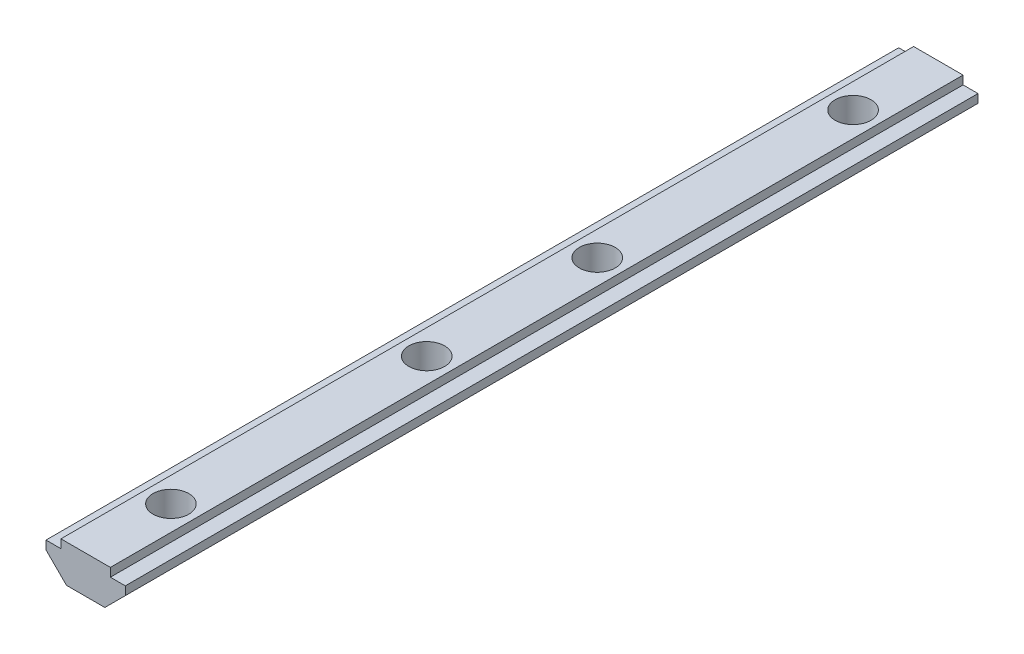
ISO-10303-21;
HEADER;
FILE_DESCRIPTION(('STEP AP214'),'2;1');
FILE_NAME('part.step','',(''),(''),'','','');
FILE_SCHEMA(('AUTOMOTIVE_DESIGN { 1 0 10303 214 1 1 1 1 }'));
ENDSEC;
DATA;
#1=APPLICATION_CONTEXT('core data for automotive mechanical design processes');
#2=APPLICATION_PROTOCOL_DEFINITION('international standard','automotive_design',2000,#1);
#3=PRODUCT_CONTEXT('',#1,'mechanical');
#4=PRODUCT('Part','Part','',(#3));
#5=PRODUCT_RELATED_PRODUCT_CATEGORY('part','',(#4));
#6=PRODUCT_DEFINITION_FORMATION('','',#4);
#7=PRODUCT_DEFINITION_CONTEXT('part definition',#1,'design');
#8=PRODUCT_DEFINITION('design','',#6,#7);
#9=PRODUCT_DEFINITION_SHAPE('','',#8);
#10=(LENGTH_UNIT() NAMED_UNIT(*) SI_UNIT(.MILLI.,.METRE.));
#11=(NAMED_UNIT(*) PLANE_ANGLE_UNIT() SI_UNIT($,.RADIAN.));
#12=(NAMED_UNIT(*) SI_UNIT($,.STERADIAN.) SOLID_ANGLE_UNIT());
#13=UNCERTAINTY_MEASURE_WITH_UNIT(LENGTH_MEASURE(1.E-05),#10,'distance_accuracy_value','');
#14=(GEOMETRIC_REPRESENTATION_CONTEXT(3) GLOBAL_UNCERTAINTY_ASSIGNED_CONTEXT((#13)) GLOBAL_UNIT_ASSIGNED_CONTEXT((#10,
#11,#12)) REPRESENTATION_CONTEXT('',''));
#15=CARTESIAN_POINT('',(0.,0.,0.));
#16=DIRECTION('',(0.,0.,1.));
#17=DIRECTION('',(1.,0.,0.));
#18=AXIS2_PLACEMENT_3D('',#15,#16,#17);
#19=CARTESIAN_POINT('',(-2.25000000000003,0.,100.));
#20=DIRECTION('',(0.707106781186551,0.707106781186544,0.));
#21=DIRECTION('',(-0.707106781186544,0.707106781186551,0.));
#22=AXIS2_PLACEMENT_3D('',#19,#20,#21);
#23=PLANE('',#22);
#24=DIRECTION('',(0.707106781186544,-0.707106781186551,0.));
#25=VECTOR('',#24,1.);
#26=CARTESIAN_POINT('',(-2.25000000000003,0.,0.));
#27=LINE('',#26,#25);
#28=CARTESIAN_POINT('',(-4.65,2.4,0.));
#29=VERTEX_POINT('',#28);
#30=CARTESIAN_POINT('',(-2.25000000000003,0.,0.));
#31=VERTEX_POINT('',#30);
#32=EDGE_CURVE('E147',#29,#31,#27,.T.);
#33=ORIENTED_EDGE('',*,*,#32,.T.);
#34=DIRECTION('',(0.,0.,-1.));
#35=VECTOR('',#34,1.);
#36=CARTESIAN_POINT('',(-2.25000000000003,0.,100.));
#37=LINE('',#36,#35);
#38=CARTESIAN_POINT('',(-2.25000000000003,0.,100.));
#39=VERTEX_POINT('',#38);
#40=EDGE_CURVE('E11',#39,#31,#37,.T.);
#41=ORIENTED_EDGE('',*,*,#40,.F.);
#42=DIRECTION('',(0.707106781186544,-0.707106781186551,0.));
#43=VECTOR('',#42,1.);
#44=CARTESIAN_POINT('',(-2.25000000000003,0.,100.));
#45=LINE('',#44,#43);
#46=CARTESIAN_POINT('',(-4.65,2.4,100.));
#47=VERTEX_POINT('',#46);
#48=EDGE_CURVE('E166',#47,#39,#45,.T.);
#49=ORIENTED_EDGE('',*,*,#48,.F.);
#50=DIRECTION('',(0.,0.,-1.));
#51=VECTOR('',#50,1.);
#52=CARTESIAN_POINT('',(-4.65,2.4,100.));
#53=LINE('',#52,#51);
#54=EDGE_CURVE('E143',#47,#29,#53,.T.);
#55=ORIENTED_EDGE('',*,*,#54,.T.);
#56=EDGE_LOOP('',(#33,#41,#49,#55));
#57=FACE_BOUND('',#56,.T.);
#58=ADVANCED_FACE('F39',(#57),#23,.F.);
#59=CARTESIAN_POINT('',(2.25000000000002,0.,100.));
#60=DIRECTION('',(0.,1.,0.));
#61=DIRECTION('',(-1.,0.,0.));
#62=AXIS2_PLACEMENT_3D('',#59,#60,#61);
#63=PLANE('',#62);
#64=CARTESIAN_POINT('',(0.,0.,10.));
#65=DIRECTION('',(0.,1.,0.));
#66=DIRECTION('',(0.,0.,1.));
#67=AXIS2_PLACEMENT_3D('',#64,#65,#66);
#68=CIRCLE('',#67,2.1);
#69=CARTESIAN_POINT('',(0.,0.,12.1));
#70=VERTEX_POINT('',#69);
#71=EDGE_CURVE('E230',#70,#70,#68,.T.);
#72=ORIENTED_EDGE('',*,*,#71,.T.);
#73=EDGE_LOOP('',(#72));
#74=FACE_BOUND('',#73,.T.);
#75=CARTESIAN_POINT('',(0.,0.,40.));
#76=DIRECTION('',(0.,1.,0.));
#77=DIRECTION('',(0.,0.,1.));
#78=AXIS2_PLACEMENT_3D('',#75,#76,#77);
#79=CIRCLE('',#78,2.1);
#80=CARTESIAN_POINT('',(0.,0.,42.1));
#81=VERTEX_POINT('',#80);
#82=EDGE_CURVE('E224',#81,#81,#79,.T.);
#83=ORIENTED_EDGE('',*,*,#82,.T.);
#84=EDGE_LOOP('',(#83));
#85=FACE_BOUND('',#84,.T.);
#86=CARTESIAN_POINT('',(0.,0.,60.));
#87=DIRECTION('',(0.,1.,0.));
#88=DIRECTION('',(0.,0.,1.));
#89=AXIS2_PLACEMENT_3D('',#86,#87,#88);
#90=CIRCLE('',#89,2.1);
#91=CARTESIAN_POINT('',(0.,0.,62.1));
#92=VERTEX_POINT('',#91);
#93=EDGE_CURVE('E218',#92,#92,#90,.T.);
#94=ORIENTED_EDGE('',*,*,#93,.T.);
#95=EDGE_LOOP('',(#94));
#96=FACE_BOUND('',#95,.T.);
#97=CARTESIAN_POINT('',(0.,0.,90.));
#98=DIRECTION('',(0.,1.,0.));
#99=DIRECTION('',(0.,0.,1.));
#100=AXIS2_PLACEMENT_3D('',#97,#98,#99);
#101=CIRCLE('',#100,2.1);
#102=CARTESIAN_POINT('',(0.,0.,92.1));
#103=VERTEX_POINT('',#102);
#104=EDGE_CURVE('E151',#103,#103,#101,.T.);
#105=ORIENTED_EDGE('',*,*,#104,.T.);
#106=EDGE_LOOP('',(#105));
#107=FACE_BOUND('',#106,.T.);
#108=DIRECTION('',(1.,0.,0.));
#109=VECTOR('',#108,1.);
#110=CARTESIAN_POINT('',(2.25000000000002,0.,0.));
#111=LINE('',#110,#109);
#112=CARTESIAN_POINT('',(2.25000000000002,0.,0.));
#113=VERTEX_POINT('',#112);
#114=EDGE_CURVE('E150',#31,#113,#111,.T.);
#115=ORIENTED_EDGE('',*,*,#114,.T.);
#116=DIRECTION('',(0.,0.,-1.));
#117=VECTOR('',#116,1.);
#118=CARTESIAN_POINT('',(2.25000000000002,0.,100.));
#119=LINE('',#118,#117);
#120=CARTESIAN_POINT('',(2.25000000000002,0.,100.));
#121=VERTEX_POINT('',#120);
#122=EDGE_CURVE('E47',#121,#113,#119,.T.);
#123=ORIENTED_EDGE('',*,*,#122,.F.);
#124=DIRECTION('',(1.,0.,0.));
#125=VECTOR('',#124,1.);
#126=CARTESIAN_POINT('',(2.25000000000002,0.,100.));
#127=LINE('',#126,#125);
#128=EDGE_CURVE('E104',#39,#121,#127,.T.);
#129=ORIENTED_EDGE('',*,*,#128,.F.);
#130=ORIENTED_EDGE('',*,*,#40,.T.);
#131=EDGE_LOOP('',(#115,#123,#129,#130));
#132=FACE_BOUND('',#131,.T.);
#133=ADVANCED_FACE('F266',(#74,#85,#96,#107,#132),#63,.F.);
#134=CARTESIAN_POINT('',(2.25000000000002,0.,100.));
#135=DIRECTION('',(-0.707106781186551,0.707106781186544,0.));
#136=DIRECTION('',(-0.707106781186544,-0.707106781186551,0.));
#137=AXIS2_PLACEMENT_3D('',#134,#135,#136);
#138=PLANE('',#137);
#139=DIRECTION('',(0.707106781186544,0.707106781186551,0.));
#140=VECTOR('',#139,1.);
#141=CARTESIAN_POINT('',(2.25000000000002,0.,0.));
#142=LINE('',#141,#140);
#143=CARTESIAN_POINT('',(4.65,2.4,0.));
#144=VERTEX_POINT('',#143);
#145=EDGE_CURVE('E153',#113,#144,#142,.T.);
#146=ORIENTED_EDGE('',*,*,#145,.T.);
#147=DIRECTION('',(0.,0.,-1.));
#148=VECTOR('',#147,1.);
#149=CARTESIAN_POINT('',(4.65,2.4,100.));
#150=LINE('',#149,#148);
#151=CARTESIAN_POINT('',(4.65,2.4,100.));
#152=VERTEX_POINT('',#151);
#153=EDGE_CURVE('E179',#152,#144,#150,.T.);
#154=ORIENTED_EDGE('',*,*,#153,.F.);
#155=DIRECTION('',(0.707106781186544,0.707106781186551,0.));
#156=VECTOR('',#155,1.);
#157=CARTESIAN_POINT('',(2.25000000000002,0.,100.));
#158=LINE('',#157,#156);
#159=EDGE_CURVE('E187',#121,#152,#158,.T.);
#160=ORIENTED_EDGE('',*,*,#159,.F.);
#161=ORIENTED_EDGE('',*,*,#122,.T.);
#162=EDGE_LOOP('',(#146,#154,#160,#161));
#163=FACE_BOUND('',#162,.T.);
#164=ADVANCED_FACE('F185',(#163),#138,.F.);
#165=CARTESIAN_POINT('',(4.65,2.4,100.));
#166=DIRECTION('',(-1.,0.,0.));
#167=DIRECTION('',(0.,0.,1.));
#168=AXIS2_PLACEMENT_3D('',#165,#166,#167);
#169=PLANE('',#168);
#170=DIRECTION('',(0.,1.,0.));
#171=VECTOR('',#170,1.);
#172=CARTESIAN_POINT('',(4.65,2.4,0.));
#173=LINE('',#172,#171);
#174=CARTESIAN_POINT('',(4.65,3.4,0.));
#175=VERTEX_POINT('',#174);
#176=EDGE_CURVE('E155',#144,#175,#173,.T.);
#177=ORIENTED_EDGE('',*,*,#176,.T.);
#178=DIRECTION('',(0.,0.,-1.));
#179=VECTOR('',#178,1.);
#180=CARTESIAN_POINT('',(4.65,3.4,100.));
#181=LINE('',#180,#179);
#182=CARTESIAN_POINT('',(4.65,3.4,100.));
#183=VERTEX_POINT('',#182);
#184=EDGE_CURVE('E176',#183,#175,#181,.T.);
#185=ORIENTED_EDGE('',*,*,#184,.F.);
#186=DIRECTION('',(0.,1.,0.));
#187=VECTOR('',#186,1.);
#188=CARTESIAN_POINT('',(4.65,2.4,100.));
#189=LINE('',#188,#187);
#190=EDGE_CURVE('E205',#152,#183,#189,.T.);
#191=ORIENTED_EDGE('',*,*,#190,.F.);
#192=ORIENTED_EDGE('',*,*,#153,.T.);
#193=EDGE_LOOP('',(#177,#185,#191,#192));
#194=FACE_BOUND('',#193,.T.);
#195=ADVANCED_FACE('F196',(#194),#169,.F.);
#196=CARTESIAN_POINT('',(4.65,3.4,100.));
#197=DIRECTION('',(0.,-1.,0.));
#198=DIRECTION('',(0.,0.,-1.));
#199=AXIS2_PLACEMENT_3D('',#196,#197,#198);
#200=PLANE('',#199);
#201=DIRECTION('',(-1.,0.,0.));
#202=VECTOR('',#201,1.);
#203=CARTESIAN_POINT('',(4.65,3.4,0.));
#204=LINE('',#203,#202);
#205=CARTESIAN_POINT('',(2.9,3.4,0.));
#206=VERTEX_POINT('',#205);
#207=EDGE_CURVE('E157',#175,#206,#204,.T.);
#208=ORIENTED_EDGE('',*,*,#207,.T.);
#209=DIRECTION('',(0.,0.,-1.));
#210=VECTOR('',#209,1.);
#211=CARTESIAN_POINT('',(2.9,3.4,100.));
#212=LINE('',#211,#210);
#213=CARTESIAN_POINT('',(2.9,3.4,100.));
#214=VERTEX_POINT('',#213);
#215=EDGE_CURVE('E173',#214,#206,#212,.T.);
#216=ORIENTED_EDGE('',*,*,#215,.F.);
#217=DIRECTION('',(-1.,0.,0.));
#218=VECTOR('',#217,1.);
#219=CARTESIAN_POINT('',(4.65,3.4,100.));
#220=LINE('',#219,#218);
#221=EDGE_CURVE('E202',#183,#214,#220,.T.);
#222=ORIENTED_EDGE('',*,*,#221,.F.);
#223=ORIENTED_EDGE('',*,*,#184,.T.);
#224=EDGE_LOOP('',(#208,#216,#222,#223));
#225=FACE_BOUND('',#224,.T.);
#226=ADVANCED_FACE('F200',(#225),#200,.F.);
#227=CARTESIAN_POINT('',(2.9,3.4,100.));
#228=DIRECTION('',(-1.,0.,0.));
#229=DIRECTION('',(0.,0.,1.));
#230=AXIS2_PLACEMENT_3D('',#227,#228,#229);
#231=PLANE('',#230);
#232=DIRECTION('',(0.,1.,0.));
#233=VECTOR('',#232,1.);
#234=CARTESIAN_POINT('',(2.9,3.4,0.));
#235=LINE('',#234,#233);
#236=CARTESIAN_POINT('',(2.9,4.4,0.));
#237=VERTEX_POINT('',#236);
#238=EDGE_CURVE('E159',#206,#237,#235,.T.);
#239=ORIENTED_EDGE('',*,*,#238,.T.);
#240=DIRECTION('',(0.,0.,-1.));
#241=VECTOR('',#240,1.);
#242=CARTESIAN_POINT('',(2.9,4.4,100.));
#243=LINE('',#242,#241);
#244=CARTESIAN_POINT('',(2.9,4.4,100.));
#245=VERTEX_POINT('',#244);
#246=EDGE_CURVE('E170',#245,#237,#243,.T.);
#247=ORIENTED_EDGE('',*,*,#246,.F.);
#248=DIRECTION('',(0.,1.,0.));
#249=VECTOR('',#248,1.);
#250=CARTESIAN_POINT('',(2.9,3.4,100.));
#251=LINE('',#250,#249);
#252=EDGE_CURVE('E204',#214,#245,#251,.T.);
#253=ORIENTED_EDGE('',*,*,#252,.F.);
#254=ORIENTED_EDGE('',*,*,#215,.T.);
#255=EDGE_LOOP('',(#239,#247,#253,#254));
#256=FACE_BOUND('',#255,.T.);
#257=ADVANCED_FACE('F242',(#256),#231,.F.);
#258=CARTESIAN_POINT('',(-2.9,4.4,100.));
#259=DIRECTION('',(0.,-1.,0.));
#260=DIRECTION('',(0.,0.,-1.));
#261=AXIS2_PLACEMENT_3D('',#258,#259,#260);
#262=PLANE('',#261);
#263=CARTESIAN_POINT('',(0.,4.4,10.));
#264=DIRECTION('',(0.,1.,0.));
#265=DIRECTION('',(0.,0.,1.));
#266=AXIS2_PLACEMENT_3D('',#263,#264,#265);
#267=CIRCLE('',#266,2.1);
#268=CARTESIAN_POINT('',(0.,4.4,12.1));
#269=VERTEX_POINT('',#268);
#270=EDGE_CURVE('E233',#269,#269,#267,.T.);
#271=ORIENTED_EDGE('',*,*,#270,.F.);
#272=EDGE_LOOP('',(#271));
#273=FACE_BOUND('',#272,.T.);
#274=CARTESIAN_POINT('',(0.,4.4,40.));
#275=DIRECTION('',(0.,1.,0.));
#276=DIRECTION('',(0.,0.,1.));
#277=AXIS2_PLACEMENT_3D('',#274,#275,#276);
#278=CIRCLE('',#277,2.1);
#279=CARTESIAN_POINT('',(0.,4.4,42.1));
#280=VERTEX_POINT('',#279);
#281=EDGE_CURVE('E227',#280,#280,#278,.T.);
#282=ORIENTED_EDGE('',*,*,#281,.F.);
#283=EDGE_LOOP('',(#282));
#284=FACE_BOUND('',#283,.T.);
#285=CARTESIAN_POINT('',(0.,4.4,60.));
#286=DIRECTION('',(0.,1.,0.));
#287=DIRECTION('',(0.,0.,1.));
#288=AXIS2_PLACEMENT_3D('',#285,#286,#287);
#289=CIRCLE('',#288,2.1);
#290=CARTESIAN_POINT('',(0.,4.4,62.1));
#291=VERTEX_POINT('',#290);
#292=EDGE_CURVE('E221',#291,#291,#289,.T.);
#293=ORIENTED_EDGE('',*,*,#292,.F.);
#294=EDGE_LOOP('',(#293));
#295=FACE_BOUND('',#294,.T.);
#296=CARTESIAN_POINT('',(0.,4.4,90.));
#297=DIRECTION('',(0.,1.,0.));
#298=DIRECTION('',(0.,0.,1.));
#299=AXIS2_PLACEMENT_3D('',#296,#297,#298);
#300=CIRCLE('',#299,2.1);
#301=CARTESIAN_POINT('',(0.,4.4,92.1));
#302=VERTEX_POINT('',#301);
#303=EDGE_CURVE('E215',#302,#302,#300,.T.);
#304=ORIENTED_EDGE('',*,*,#303,.F.);
#305=EDGE_LOOP('',(#304));
#306=FACE_BOUND('',#305,.T.);
#307=DIRECTION('',(-1.,0.,0.));
#308=VECTOR('',#307,1.);
#309=CARTESIAN_POINT('',(-2.9,4.4,0.));
#310=LINE('',#309,#308);
#311=CARTESIAN_POINT('',(-2.9,4.4,0.));
#312=VERTEX_POINT('',#311);
#313=EDGE_CURVE('E161',#237,#312,#310,.T.);
#314=ORIENTED_EDGE('',*,*,#313,.T.);
#315=DIRECTION('',(0.,0.,-1.));
#316=VECTOR('',#315,1.);
#317=CARTESIAN_POINT('',(-2.9,4.4,100.));
#318=LINE('',#317,#316);
#319=CARTESIAN_POINT('',(-2.9,4.4,100.));
#320=VERTEX_POINT('',#319);
#321=EDGE_CURVE('E138',#320,#312,#318,.T.);
#322=ORIENTED_EDGE('',*,*,#321,.F.);
#323=DIRECTION('',(-1.,0.,0.));
#324=VECTOR('',#323,1.);
#325=CARTESIAN_POINT('',(-2.9,4.4,100.));
#326=LINE('',#325,#324);
#327=EDGE_CURVE('E129',#245,#320,#326,.T.);
#328=ORIENTED_EDGE('',*,*,#327,.F.);
#329=ORIENTED_EDGE('',*,*,#246,.T.);
#330=EDGE_LOOP('',(#314,#322,#328,#329));
#331=FACE_BOUND('',#330,.T.);
#332=ADVANCED_FACE('F239',(#273,#284,#295,#306,#331),#262,.F.);
#333=CARTESIAN_POINT('',(-2.9,3.4,100.));
#334=DIRECTION('',(1.,0.,0.));
#335=DIRECTION('',(0.,0.,-1.));
#336=AXIS2_PLACEMENT_3D('',#333,#334,#335);
#337=PLANE('',#336);
#338=DIRECTION('',(0.,-1.,0.));
#339=VECTOR('',#338,1.);
#340=CARTESIAN_POINT('',(-2.9,3.4,0.));
#341=LINE('',#340,#339);
#342=CARTESIAN_POINT('',(-2.9,3.4,0.));
#343=VERTEX_POINT('',#342);
#344=EDGE_CURVE('E137',#312,#343,#341,.T.);
#345=ORIENTED_EDGE('',*,*,#344,.T.);
#346=DIRECTION('',(0.,0.,-1.));
#347=VECTOR('',#346,1.);
#348=CARTESIAN_POINT('',(-2.9,3.4,100.));
#349=LINE('',#348,#347);
#350=CARTESIAN_POINT('',(-2.9,3.4,100.));
#351=VERTEX_POINT('',#350);
#352=EDGE_CURVE('E134',#351,#343,#349,.T.);
#353=ORIENTED_EDGE('',*,*,#352,.F.);
#354=DIRECTION('',(0.,-1.,0.));
#355=VECTOR('',#354,1.);
#356=CARTESIAN_POINT('',(-2.9,3.4,100.));
#357=LINE('',#356,#355);
#358=EDGE_CURVE('E123',#320,#351,#357,.T.);
#359=ORIENTED_EDGE('',*,*,#358,.F.);
#360=ORIENTED_EDGE('',*,*,#321,.T.);
#361=EDGE_LOOP('',(#345,#353,#359,#360));
#362=FACE_BOUND('',#361,.T.);
#363=ADVANCED_FACE('F135',(#362),#337,.F.);
#364=CARTESIAN_POINT('',(-4.65,3.4,100.));
#365=DIRECTION('',(0.,-1.,0.));
#366=DIRECTION('',(0.,0.,-1.));
#367=AXIS2_PLACEMENT_3D('',#364,#365,#366);
#368=PLANE('',#367);
#369=DIRECTION('',(-1.,0.,0.));
#370=VECTOR('',#369,1.);
#371=CARTESIAN_POINT('',(-4.65,3.4,0.));
#372=LINE('',#371,#370);
#373=CARTESIAN_POINT('',(-4.65,3.4,0.));
#374=VERTEX_POINT('',#373);
#375=EDGE_CURVE('E90',#343,#374,#372,.T.);
#376=ORIENTED_EDGE('',*,*,#375,.T.);
#377=DIRECTION('',(0.,0.,-1.));
#378=VECTOR('',#377,1.);
#379=CARTESIAN_POINT('',(-4.65,3.4,100.));
#380=LINE('',#379,#378);
#381=CARTESIAN_POINT('',(-4.65,3.4,100.));
#382=VERTEX_POINT('',#381);
#383=EDGE_CURVE('E139',#382,#374,#380,.T.);
#384=ORIENTED_EDGE('',*,*,#383,.F.);
#385=DIRECTION('',(-1.,0.,0.));
#386=VECTOR('',#385,1.);
#387=CARTESIAN_POINT('',(-4.65,3.4,100.));
#388=LINE('',#387,#386);
#389=EDGE_CURVE('E127',#351,#382,#388,.T.);
#390=ORIENTED_EDGE('',*,*,#389,.F.);
#391=ORIENTED_EDGE('',*,*,#352,.T.);
#392=EDGE_LOOP('',(#376,#384,#390,#391));
#393=FACE_BOUND('',#392,.T.);
#394=ADVANCED_FACE('F141',(#393),#368,.F.);
#395=CARTESIAN_POINT('',(-4.65,2.4,100.));
#396=DIRECTION('',(1.,0.,0.));
#397=DIRECTION('',(0.,0.,-1.));
#398=AXIS2_PLACEMENT_3D('',#395,#396,#397);
#399=PLANE('',#398);
#400=DIRECTION('',(0.,-1.,0.));
#401=VECTOR('',#400,1.);
#402=CARTESIAN_POINT('',(-4.65,2.4,0.));
#403=LINE('',#402,#401);
#404=EDGE_CURVE('E96',#374,#29,#403,.T.);
#405=ORIENTED_EDGE('',*,*,#404,.T.);
#406=ORIENTED_EDGE('',*,*,#54,.F.);
#407=DIRECTION('',(0.,-1.,0.));
#408=VECTOR('',#407,1.);
#409=CARTESIAN_POINT('',(-4.65,2.4,100.));
#410=LINE('',#409,#408);
#411=EDGE_CURVE('E55',#382,#47,#410,.T.);
#412=ORIENTED_EDGE('',*,*,#411,.F.);
#413=ORIENTED_EDGE('',*,*,#383,.T.);
#414=EDGE_LOOP('',(#405,#406,#412,#413));
#415=FACE_BOUND('',#414,.T.);
#416=ADVANCED_FACE('F255',(#415),#399,.F.);
#417=CARTESIAN_POINT('',(0.,0.,100.));
#418=DIRECTION('',(0.,0.,-1.));
#419=DIRECTION('',(-1.,0.,0.));
#420=AXIS2_PLACEMENT_3D('',#417,#418,#419);
#421=PLANE('',#420);
#422=ORIENTED_EDGE('',*,*,#48,.T.);
#423=ORIENTED_EDGE('',*,*,#128,.T.);
#424=ORIENTED_EDGE('',*,*,#159,.T.);
#425=ORIENTED_EDGE('',*,*,#190,.T.);
#426=ORIENTED_EDGE('',*,*,#221,.T.);
#427=ORIENTED_EDGE('',*,*,#252,.T.);
#428=ORIENTED_EDGE('',*,*,#327,.T.);
#429=ORIENTED_EDGE('',*,*,#358,.T.);
#430=ORIENTED_EDGE('',*,*,#389,.T.);
#431=ORIENTED_EDGE('',*,*,#411,.T.);
#432=EDGE_LOOP('',(#422,#423,#424,#425,#426,#427,#428,#429,#430,#431));
#433=FACE_BOUND('',#432,.T.);
#434=ADVANCED_FACE('F125',(#433),#421,.F.);
#435=CARTESIAN_POINT('',(0.,0.,0.));
#436=DIRECTION('',(0.,0.,-1.));
#437=DIRECTION('',(-1.,0.,0.));
#438=AXIS2_PLACEMENT_3D('',#435,#436,#437);
#439=PLANE('',#438);
#440=ORIENTED_EDGE('',*,*,#32,.F.);
#441=ORIENTED_EDGE('',*,*,#404,.F.);
#442=ORIENTED_EDGE('',*,*,#375,.F.);
#443=ORIENTED_EDGE('',*,*,#344,.F.);
#444=ORIENTED_EDGE('',*,*,#313,.F.);
#445=ORIENTED_EDGE('',*,*,#238,.F.);
#446=ORIENTED_EDGE('',*,*,#207,.F.);
#447=ORIENTED_EDGE('',*,*,#176,.F.);
#448=ORIENTED_EDGE('',*,*,#145,.F.);
#449=ORIENTED_EDGE('',*,*,#114,.F.);
#450=EDGE_LOOP('',(#440,#441,#442,#443,#444,#445,#446,#447,#448,#449));
#451=FACE_BOUND('',#450,.T.);
#452=ADVANCED_FACE('F191',(#451),#439,.T.);
#453=CARTESIAN_POINT('',(0.,4.4,90.));
#454=DIRECTION('',(0.,1.,0.));
#455=DIRECTION('',(0.,0.,1.));
#456=AXIS2_PLACEMENT_3D('',#453,#454,#455);
#457=CYLINDRICAL_SURFACE('',#456,2.1);
#458=ORIENTED_EDGE('',*,*,#104,.F.);
#459=EDGE_LOOP('',(#458));
#460=FACE_BOUND('',#459,.T.);
#461=ORIENTED_EDGE('',*,*,#303,.T.);
#462=EDGE_LOOP('',(#461));
#463=FACE_BOUND('',#462,.T.);
#464=ADVANCED_FACE('F315',(#460,#463),#457,.F.);
#465=CARTESIAN_POINT('',(0.,4.4,60.));
#466=DIRECTION('',(0.,1.,0.));
#467=DIRECTION('',(0.,0.,1.));
#468=AXIS2_PLACEMENT_3D('',#465,#466,#467);
#469=CYLINDRICAL_SURFACE('',#468,2.1);
#470=ORIENTED_EDGE('',*,*,#93,.F.);
#471=EDGE_LOOP('',(#470));
#472=FACE_BOUND('',#471,.T.);
#473=ORIENTED_EDGE('',*,*,#292,.T.);
#474=EDGE_LOOP('',(#473));
#475=FACE_BOUND('',#474,.T.);
#476=ADVANCED_FACE('F339',(#472,#475),#469,.F.);
#477=CARTESIAN_POINT('',(0.,4.4,40.));
#478=DIRECTION('',(0.,1.,0.));
#479=DIRECTION('',(0.,0.,1.));
#480=AXIS2_PLACEMENT_3D('',#477,#478,#479);
#481=CYLINDRICAL_SURFACE('',#480,2.1);
#482=ORIENTED_EDGE('',*,*,#82,.F.);
#483=EDGE_LOOP('',(#482));
#484=FACE_BOUND('',#483,.T.);
#485=ORIENTED_EDGE('',*,*,#281,.T.);
#486=EDGE_LOOP('',(#485));
#487=FACE_BOUND('',#486,.T.);
#488=ADVANCED_FACE('F351',(#484,#487),#481,.F.);
#489=CARTESIAN_POINT('',(0.,4.4,10.));
#490=DIRECTION('',(0.,1.,0.));
#491=DIRECTION('',(0.,0.,1.));
#492=AXIS2_PLACEMENT_3D('',#489,#490,#491);
#493=CYLINDRICAL_SURFACE('',#492,2.1);
#494=ORIENTED_EDGE('',*,*,#71,.F.);
#495=EDGE_LOOP('',(#494));
#496=FACE_BOUND('',#495,.T.);
#497=ORIENTED_EDGE('',*,*,#270,.T.);
#498=EDGE_LOOP('',(#497));
#499=FACE_BOUND('',#498,.T.);
#500=ADVANCED_FACE('F237',(#496,#499),#493,.F.);
#501=CLOSED_SHELL('',(#58,#133,#164,#195,#226,#257,#332,#363,#394,#416,#434,#452,#464,#476,#488,#500));
#502=MANIFOLD_SOLID_BREP('B2',#501);
#503=ADVANCED_BREP_SHAPE_REPRESENTATION('',(#18,#502),#14);
#504=SHAPE_DEFINITION_REPRESENTATION(#9,#503);
ENDSEC;
END-ISO-10303-21;
